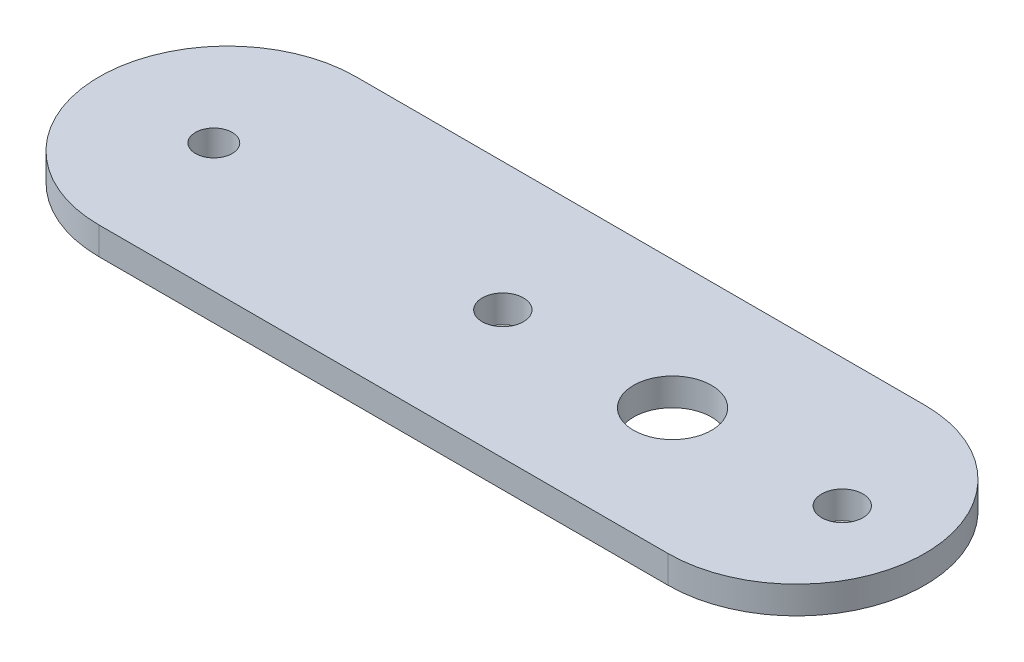
ISO-10303-21;
HEADER;
FILE_DESCRIPTION(('STEP AP214'),'2;1');
FILE_NAME('part.step','',(''),(''),'','','');
FILE_SCHEMA(('AUTOMOTIVE_DESIGN { 1 0 10303 214 1 1 1 1 }'));
ENDSEC;
DATA;
#1=APPLICATION_CONTEXT('core data for automotive mechanical design processes');
#2=APPLICATION_PROTOCOL_DEFINITION('international standard','automotive_design',2000,#1);
#3=PRODUCT_CONTEXT('',#1,'mechanical');
#4=PRODUCT('Part','Part','',(#3));
#5=PRODUCT_RELATED_PRODUCT_CATEGORY('part','',(#4));
#6=PRODUCT_DEFINITION_FORMATION('','',#4);
#7=PRODUCT_DEFINITION_CONTEXT('part definition',#1,'design');
#8=PRODUCT_DEFINITION('design','',#6,#7);
#9=PRODUCT_DEFINITION_SHAPE('','',#8);
#10=(LENGTH_UNIT() NAMED_UNIT(*) SI_UNIT(.MILLI.,.METRE.));
#11=(NAMED_UNIT(*) PLANE_ANGLE_UNIT() SI_UNIT($,.RADIAN.));
#12=(NAMED_UNIT(*) SI_UNIT($,.STERADIAN.) SOLID_ANGLE_UNIT());
#13=UNCERTAINTY_MEASURE_WITH_UNIT(LENGTH_MEASURE(1.E-05),#10,'distance_accuracy_value','');
#14=(GEOMETRIC_REPRESENTATION_CONTEXT(3) GLOBAL_UNCERTAINTY_ASSIGNED_CONTEXT((#13)) GLOBAL_UNIT_ASSIGNED_CONTEXT((#10,
#11,#12)) REPRESENTATION_CONTEXT('',''));
#15=CARTESIAN_POINT('',(0.,0.,0.));
#16=DIRECTION('',(0.,0.,1.));
#17=DIRECTION('',(1.,0.,0.));
#18=AXIS2_PLACEMENT_3D('',#15,#16,#17);
#19=CARTESIAN_POINT('',(-31.,0.,0.));
#20=DIRECTION('',(0.,-1.,0.));
#21=DIRECTION('',(0.,0.,-1.));
#22=AXIS2_PLACEMENT_3D('',#19,#20,#21);
#23=CYLINDRICAL_SURFACE('',#22,14.);
#24=DIRECTION('',(0.,-1.,0.));
#25=VECTOR('',#24,1.);
#26=CARTESIAN_POINT('',(-31.,3.,-14.));
#27=LINE('',#26,#25);
#28=CARTESIAN_POINT('',(-31.,0.,-14.));
#29=VERTEX_POINT('',#28);
#30=CARTESIAN_POINT('',(-31.,3.,-14.));
#31=VERTEX_POINT('',#30);
#32=EDGE_CURVE('E82',#29,#31,#27,.F.);
#33=ORIENTED_EDGE('',*,*,#32,.F.);
#34=CARTESIAN_POINT('',(-31.,0.,0.));
#35=DIRECTION('',(0.,1.,0.));
#36=DIRECTION('',(0.,0.,1.));
#37=AXIS2_PLACEMENT_3D('',#34,#35,#36);
#38=CIRCLE('',#37,14.);
#39=CARTESIAN_POINT('',(-31.,0.,14.));
#40=VERTEX_POINT('',#39);
#41=EDGE_CURVE('E40',#40,#29,#38,.F.);
#42=ORIENTED_EDGE('',*,*,#41,.F.);
#43=DIRECTION('',(0.,-1.,0.));
#44=VECTOR('',#43,1.);
#45=CARTESIAN_POINT('',(-31.,3.,14.));
#46=LINE('',#45,#44);
#47=CARTESIAN_POINT('',(-31.,3.,14.));
#48=VERTEX_POINT('',#47);
#49=EDGE_CURVE('E108',#48,#40,#46,.T.);
#50=ORIENTED_EDGE('',*,*,#49,.F.);
#51=CARTESIAN_POINT('',(-31.,3.,0.));
#52=DIRECTION('',(0.,1.,0.));
#53=DIRECTION('',(0.,0.,1.));
#54=AXIS2_PLACEMENT_3D('',#51,#52,#53);
#55=CIRCLE('',#54,14.);
#56=EDGE_CURVE('E11',#31,#48,#55,.T.);
#57=ORIENTED_EDGE('',*,*,#56,.F.);
#58=EDGE_LOOP('',(#33,#42,#50,#57));
#59=FACE_BOUND('',#58,.T.);
#60=ADVANCED_FACE('F33',(#59),#23,.T.);
#61=CARTESIAN_POINT('',(31.,3.,0.));
#62=DIRECTION('',(0.,-1.,0.));
#63=DIRECTION('',(0.,0.,-1.));
#64=AXIS2_PLACEMENT_3D('',#61,#62,#63);
#65=CYLINDRICAL_SURFACE('',#64,14.);
#66=DIRECTION('',(0.,-1.,0.));
#67=VECTOR('',#66,1.);
#68=CARTESIAN_POINT('',(31.,3.,-14.));
#69=LINE('',#68,#67);
#70=CARTESIAN_POINT('',(30.9999999999999,3.,-14.));
#71=VERTEX_POINT('',#70);
#72=CARTESIAN_POINT('',(30.9999999999999,0.,-14.));
#73=VERTEX_POINT('',#72);
#74=EDGE_CURVE('E75',#71,#73,#69,.T.);
#75=ORIENTED_EDGE('',*,*,#74,.F.);
#76=CARTESIAN_POINT('',(31.,3.,0.));
#77=DIRECTION('',(0.,1.,0.));
#78=DIRECTION('',(0.,0.,1.));
#79=AXIS2_PLACEMENT_3D('',#76,#77,#78);
#80=CIRCLE('',#79,14.);
#81=CARTESIAN_POINT('',(30.9999999999999,3.,14.));
#82=VERTEX_POINT('',#81);
#83=EDGE_CURVE('E83',#82,#71,#80,.T.);
#84=ORIENTED_EDGE('',*,*,#83,.F.);
#85=DIRECTION('',(0.,-1.,0.));
#86=VECTOR('',#85,1.);
#87=CARTESIAN_POINT('',(31.,3.,14.));
#88=LINE('',#87,#86);
#89=CARTESIAN_POINT('',(30.9999999999999,0.,14.));
#90=VERTEX_POINT('',#89);
#91=EDGE_CURVE('E78',#90,#82,#88,.F.);
#92=ORIENTED_EDGE('',*,*,#91,.F.);
#93=CARTESIAN_POINT('',(31.,0.,0.));
#94=DIRECTION('',(0.,1.,0.));
#95=DIRECTION('',(0.,0.,1.));
#96=AXIS2_PLACEMENT_3D('',#93,#94,#95);
#97=CIRCLE('',#96,14.);
#98=EDGE_CURVE('E71',#73,#90,#97,.F.);
#99=ORIENTED_EDGE('',*,*,#98,.F.);
#100=EDGE_LOOP('',(#75,#84,#92,#99));
#101=FACE_BOUND('',#100,.T.);
#102=ADVANCED_FACE('F73',(#101),#65,.T.);
#103=CARTESIAN_POINT('',(0.,3.,0.));
#104=DIRECTION('',(0.,1.,0.));
#105=DIRECTION('',(0.,0.,1.));
#106=AXIS2_PLACEMENT_3D('',#103,#104,#105);
#107=PLANE('',#106);
#108=CARTESIAN_POINT('',(-1.00000000000002,3.,0.));
#109=DIRECTION('',(0.,1.,0.));
#110=DIRECTION('',(0.,0.,1.));
#111=AXIS2_PLACEMENT_3D('',#108,#109,#110);
#112=CIRCLE('',#111,2.25);
#113=CARTESIAN_POINT('',(-1.00000000000002,3.,2.25));
#114=VERTEX_POINT('',#113);
#115=EDGE_CURVE('E132',#114,#114,#112,.T.);
#116=ORIENTED_EDGE('',*,*,#115,.F.);
#117=EDGE_LOOP('',(#116));
#118=FACE_BOUND('',#117,.T.);
#119=CARTESIAN_POINT('',(36.,3.,0.));
#120=DIRECTION('',(0.,1.,0.));
#121=DIRECTION('',(0.,0.,1.));
#122=AXIS2_PLACEMENT_3D('',#119,#120,#121);
#123=CIRCLE('',#122,2.25);
#124=CARTESIAN_POINT('',(36.,3.,2.25));
#125=VERTEX_POINT('',#124);
#126=EDGE_CURVE('E126',#125,#125,#123,.T.);
#127=ORIENTED_EDGE('',*,*,#126,.F.);
#128=EDGE_LOOP('',(#127));
#129=FACE_BOUND('',#128,.T.);
#130=CARTESIAN_POINT('',(17.5,3.,0.));
#131=DIRECTION('',(0.,1.,0.));
#132=DIRECTION('',(0.,0.,1.));
#133=AXIS2_PLACEMENT_3D('',#130,#131,#132);
#134=CIRCLE('',#133,4.25000000000001);
#135=CARTESIAN_POINT('',(17.5,3.,4.25000000000001));
#136=VERTEX_POINT('',#135);
#137=EDGE_CURVE('E96',#136,#136,#134,.T.);
#138=ORIENTED_EDGE('',*,*,#137,.F.);
#139=EDGE_LOOP('',(#138));
#140=FACE_BOUND('',#139,.T.);
#141=DIRECTION('',(-1.,0.,0.));
#142=VECTOR('',#141,1.);
#143=CARTESIAN_POINT('',(-45.,3.,-14.));
#144=LINE('',#143,#142);
#145=EDGE_CURVE('E90',#71,#31,#144,.T.);
#146=ORIENTED_EDGE('',*,*,#145,.T.);
#147=ORIENTED_EDGE('',*,*,#56,.T.);
#148=DIRECTION('',(1.,0.,0.));
#149=VECTOR('',#148,1.);
#150=CARTESIAN_POINT('',(-45.,3.,14.));
#151=LINE('',#150,#149);
#152=EDGE_CURVE('E91',#48,#82,#151,.T.);
#153=ORIENTED_EDGE('',*,*,#152,.T.);
#154=ORIENTED_EDGE('',*,*,#83,.T.);
#155=EDGE_LOOP('',(#146,#147,#153,#154));
#156=FACE_BOUND('',#155,.T.);
#157=CARTESIAN_POINT('',(-32.5,3.,0.));
#158=DIRECTION('',(0.,1.,0.));
#159=DIRECTION('',(0.,0.,1.));
#160=AXIS2_PLACEMENT_3D('',#157,#158,#159);
#161=CIRCLE('',#160,2.);
#162=CARTESIAN_POINT('',(-32.5,3.,2.));
#163=VERTEX_POINT('',#162);
#164=EDGE_CURVE('E116',#163,#163,#161,.T.);
#165=ORIENTED_EDGE('',*,*,#164,.F.);
#166=EDGE_LOOP('',(#165));
#167=FACE_BOUND('',#166,.T.);
#168=ADVANCED_FACE('F112',(#118,#129,#140,#156,#167),#107,.T.);
#169=CARTESIAN_POINT('',(0.,0.,0.));
#170=DIRECTION('',(0.,1.,0.));
#171=DIRECTION('',(0.,0.,1.));
#172=AXIS2_PLACEMENT_3D('',#169,#170,#171);
#173=PLANE('',#172);
#174=CARTESIAN_POINT('',(-1.00000000000002,0.,0.));
#175=DIRECTION('',(0.,1.,0.));
#176=DIRECTION('',(0.,0.,1.));
#177=AXIS2_PLACEMENT_3D('',#174,#175,#176);
#178=CIRCLE('',#177,2.25);
#179=CARTESIAN_POINT('',(-1.00000000000002,0.,2.25));
#180=VERTEX_POINT('',#179);
#181=EDGE_CURVE('E129',#180,#180,#178,.F.);
#182=ORIENTED_EDGE('',*,*,#181,.F.);
#183=EDGE_LOOP('',(#182));
#184=FACE_BOUND('',#183,.T.);
#185=CARTESIAN_POINT('',(36.,0.,0.));
#186=DIRECTION('',(0.,1.,0.));
#187=DIRECTION('',(0.,0.,1.));
#188=AXIS2_PLACEMENT_3D('',#185,#186,#187);
#189=CIRCLE('',#188,2.25);
#190=CARTESIAN_POINT('',(36.,0.,2.25));
#191=VERTEX_POINT('',#190);
#192=EDGE_CURVE('E121',#191,#191,#189,.F.);
#193=ORIENTED_EDGE('',*,*,#192,.F.);
#194=EDGE_LOOP('',(#193));
#195=FACE_BOUND('',#194,.T.);
#196=CARTESIAN_POINT('',(17.5,0.,0.));
#197=DIRECTION('',(0.,1.,0.));
#198=DIRECTION('',(0.,0.,1.));
#199=AXIS2_PLACEMENT_3D('',#196,#197,#198);
#200=CIRCLE('',#199,4.25000000000001);
#201=CARTESIAN_POINT('',(17.5,0.,4.25000000000001));
#202=VERTEX_POINT('',#201);
#203=EDGE_CURVE('E100',#202,#202,#200,.T.);
#204=ORIENTED_EDGE('',*,*,#203,.T.);
#205=EDGE_LOOP('',(#204));
#206=FACE_BOUND('',#205,.T.);
#207=DIRECTION('',(1.,0.,0.));
#208=VECTOR('',#207,1.);
#209=CARTESIAN_POINT('',(-45.,0.,14.));
#210=LINE('',#209,#208);
#211=EDGE_CURVE('E95',#40,#90,#210,.T.);
#212=ORIENTED_EDGE('',*,*,#211,.F.);
#213=ORIENTED_EDGE('',*,*,#41,.T.);
#214=DIRECTION('',(-1.,0.,0.));
#215=VECTOR('',#214,1.);
#216=CARTESIAN_POINT('',(-45.,0.,-14.));
#217=LINE('',#216,#215);
#218=EDGE_CURVE('E89',#73,#29,#217,.T.);
#219=ORIENTED_EDGE('',*,*,#218,.F.);
#220=ORIENTED_EDGE('',*,*,#98,.T.);
#221=EDGE_LOOP('',(#212,#213,#219,#220));
#222=FACE_BOUND('',#221,.T.);
#223=CARTESIAN_POINT('',(-32.5,0.,0.));
#224=DIRECTION('',(0.,1.,0.));
#225=DIRECTION('',(0.,0.,1.));
#226=AXIS2_PLACEMENT_3D('',#223,#224,#225);
#227=CIRCLE('',#226,2.);
#228=CARTESIAN_POINT('',(-32.5,0.,2.));
#229=VERTEX_POINT('',#228);
#230=EDGE_CURVE('E118',#229,#229,#227,.T.);
#231=ORIENTED_EDGE('',*,*,#230,.T.);
#232=EDGE_LOOP('',(#231));
#233=FACE_BOUND('',#232,.T.);
#234=ADVANCED_FACE('F93',(#184,#195,#206,#222,#233),#173,.F.);
#235=CARTESIAN_POINT('',(-45.,3.,-14.));
#236=DIRECTION('',(0.,0.,1.));
#237=DIRECTION('',(1.,0.,0.));
#238=AXIS2_PLACEMENT_3D('',#235,#236,#237);
#239=PLANE('',#238);
#240=ORIENTED_EDGE('',*,*,#218,.T.);
#241=ORIENTED_EDGE('',*,*,#32,.T.);
#242=ORIENTED_EDGE('',*,*,#145,.F.);
#243=ORIENTED_EDGE('',*,*,#74,.T.);
#244=EDGE_LOOP('',(#240,#241,#242,#243));
#245=FACE_BOUND('',#244,.T.);
#246=ADVANCED_FACE('F87',(#245),#239,.F.);
#247=CARTESIAN_POINT('',(-45.,3.,14.));
#248=DIRECTION('',(0.,0.,-1.));
#249=DIRECTION('',(-1.,0.,0.));
#250=AXIS2_PLACEMENT_3D('',#247,#248,#249);
#251=PLANE('',#250);
#252=ORIENTED_EDGE('',*,*,#152,.F.);
#253=ORIENTED_EDGE('',*,*,#49,.T.);
#254=ORIENTED_EDGE('',*,*,#211,.T.);
#255=ORIENTED_EDGE('',*,*,#91,.T.);
#256=EDGE_LOOP('',(#252,#253,#254,#255));
#257=FACE_BOUND('',#256,.T.);
#258=ADVANCED_FACE('F111',(#257),#251,.F.);
#259=CARTESIAN_POINT('',(17.5,3.,0.));
#260=DIRECTION('',(0.,-1.,0.));
#261=DIRECTION('',(0.,0.,-1.));
#262=AXIS2_PLACEMENT_3D('',#259,#260,#261);
#263=CYLINDRICAL_SURFACE('',#262,4.25000000000001);
#264=ORIENTED_EDGE('',*,*,#137,.T.);
#265=EDGE_LOOP('',(#264));
#266=FACE_BOUND('',#265,.T.);
#267=ORIENTED_EDGE('',*,*,#203,.F.);
#268=EDGE_LOOP('',(#267));
#269=FACE_BOUND('',#268,.T.);
#270=ADVANCED_FACE('F146',(#266,#269),#263,.F.);
#271=CARTESIAN_POINT('',(-32.5,3.,0.));
#272=DIRECTION('',(0.,-1.,0.));
#273=DIRECTION('',(0.,0.,-1.));
#274=AXIS2_PLACEMENT_3D('',#271,#272,#273);
#275=CYLINDRICAL_SURFACE('',#274,2.);
#276=ORIENTED_EDGE('',*,*,#164,.T.);
#277=EDGE_LOOP('',(#276));
#278=FACE_BOUND('',#277,.T.);
#279=ORIENTED_EDGE('',*,*,#230,.F.);
#280=EDGE_LOOP('',(#279));
#281=FACE_BOUND('',#280,.T.);
#282=ADVANCED_FACE('F149',(#278,#281),#275,.F.);
#283=CARTESIAN_POINT('',(36.,-0.00100000000000013,0.));
#284=DIRECTION('',(0.,1.,0.));
#285=DIRECTION('',(0.,0.,1.));
#286=AXIS2_PLACEMENT_3D('',#283,#284,#285);
#287=CYLINDRICAL_SURFACE('',#286,2.25);
#288=CARTESIAN_POINT('',(36.,3.,2.25));
#289=CARTESIAN_POINT('',(36.,2.96875,2.25));
#290=CARTESIAN_POINT('',(36.,2.9375,2.25));
#291=CARTESIAN_POINT('',(36.,2.875,2.25));
#292=CARTESIAN_POINT('',(36.,2.84375,2.25));
#293=CARTESIAN_POINT('',(36.,2.78125,2.25));
#294=CARTESIAN_POINT('',(36.,2.75,2.25));
#295=CARTESIAN_POINT('',(36.,2.6875,2.25));
#296=CARTESIAN_POINT('',(36.,2.65625,2.25));
#297=CARTESIAN_POINT('',(36.,2.59375,2.25));
#298=CARTESIAN_POINT('',(36.,2.5625,2.25));
#299=CARTESIAN_POINT('',(36.,2.5,2.25));
#300=CARTESIAN_POINT('',(36.,2.46875,2.25));
#301=CARTESIAN_POINT('',(36.,2.40625,2.25));
#302=CARTESIAN_POINT('',(36.,2.375,2.25));
#303=CARTESIAN_POINT('',(36.,2.3125,2.25));
#304=CARTESIAN_POINT('',(36.,2.28125,2.25));
#305=CARTESIAN_POINT('',(36.,2.21875,2.25));
#306=CARTESIAN_POINT('',(36.,2.1875,2.25));
#307=CARTESIAN_POINT('',(36.,2.125,2.25));
#308=CARTESIAN_POINT('',(36.,2.09375,2.25));
#309=CARTESIAN_POINT('',(36.,2.03125,2.25));
#310=CARTESIAN_POINT('',(36.,2.,2.25));
#311=CARTESIAN_POINT('',(36.,1.9375,2.25));
#312=CARTESIAN_POINT('',(36.,1.90625,2.25));
#313=CARTESIAN_POINT('',(36.,1.84375,2.25));
#314=CARTESIAN_POINT('',(36.,1.8125,2.25));
#315=CARTESIAN_POINT('',(36.,1.75,2.25));
#316=CARTESIAN_POINT('',(36.,1.71875,2.25));
#317=CARTESIAN_POINT('',(36.,1.65625,2.25));
#318=CARTESIAN_POINT('',(36.,1.625,2.25));
#319=CARTESIAN_POINT('',(36.,1.5625,2.25));
#320=CARTESIAN_POINT('',(36.,1.53125,2.25));
#321=CARTESIAN_POINT('',(36.,1.46875,2.25));
#322=CARTESIAN_POINT('',(36.,1.4375,2.25));
#323=CARTESIAN_POINT('',(36.,1.375,2.25));
#324=CARTESIAN_POINT('',(36.,1.34375,2.25));
#325=CARTESIAN_POINT('',(36.,1.28125,2.25));
#326=CARTESIAN_POINT('',(36.,1.25,2.25));
#327=CARTESIAN_POINT('',(36.,1.1875,2.25));
#328=CARTESIAN_POINT('',(36.,1.15625,2.25));
#329=CARTESIAN_POINT('',(36.,1.09375,2.25));
#330=CARTESIAN_POINT('',(36.,1.0625,2.25));
#331=CARTESIAN_POINT('',(36.,1.,2.25));
#332=CARTESIAN_POINT('',(36.,0.96875,2.25));
#333=CARTESIAN_POINT('',(36.,0.90625,2.25));
#334=CARTESIAN_POINT('',(36.,0.875,2.25));
#335=CARTESIAN_POINT('',(36.,0.8125,2.25));
#336=CARTESIAN_POINT('',(36.,0.78125,2.25));
#337=CARTESIAN_POINT('',(36.,0.71875,2.25));
#338=CARTESIAN_POINT('',(36.,0.6875,2.25));
#339=CARTESIAN_POINT('',(36.,0.625,2.25));
#340=CARTESIAN_POINT('',(36.,0.59375,2.25));
#341=CARTESIAN_POINT('',(36.,0.53125,2.25));
#342=CARTESIAN_POINT('',(36.,0.5,2.25));
#343=CARTESIAN_POINT('',(36.,0.4375,2.25));
#344=CARTESIAN_POINT('',(36.,0.40625,2.25));
#345=CARTESIAN_POINT('',(36.,0.34375,2.25));
#346=CARTESIAN_POINT('',(36.,0.3125,2.25));
#347=CARTESIAN_POINT('',(36.,0.25,2.25));
#348=CARTESIAN_POINT('',(36.,0.21875,2.25));
#349=CARTESIAN_POINT('',(36.,0.15625,2.25));
#350=CARTESIAN_POINT('',(36.,0.125,2.25));
#351=CARTESIAN_POINT('',(36.,0.0625000000000001,2.25));
#352=CARTESIAN_POINT('',(36.,0.0312500000000001,2.25));
#353=CARTESIAN_POINT('',(36.,0.,2.25));
#354=B_SPLINE_CURVE_WITH_KNOTS('',3,(#288,#289,#290,#291,#292,#293,#294,#295,#296,#297,#298,
#299,#300,#301,#302,#303,#304,#305,#306,#307,#308,#309,#310,#311,#312,#313,#314,#315,#316,#317,
#318,#319,#320,#321,#322,#323,#324,#325,#326,#327,#328,#329,#330,#331,#332,#333,#334,#335,#336,
#337,#338,#339,#340,#341,#342,#343,#344,#345,#346,#347,#348,#349,#350,#351,#352,#353),
.UNSPECIFIED.,.F.,.F.,(4,2,2,2,2,2,2,2,2,2,2,2,2,2,2,2,2,2,2,2,2,2,2,2,2,2,2,2,2,2,2,2,4),(0.,
0.0937500000000001,0.1875,0.28125,0.375,0.46875,0.5625,0.65625,0.75,0.84375,0.9375,1.03125,
1.125,1.21875,1.3125,1.40625,1.5,1.59375,1.6875,1.78125,1.875,1.96875,2.0625,2.15625,2.25,
2.34375,2.4375,2.53125,2.625,2.71875,2.8125,2.90625,3.),.UNSPECIFIED.);
#355=EDGE_CURVE('BSEAM184',#125,#191,#354,.T.);
#356=ORIENTED_EDGE('',*,*,#126,.T.);
#357=ORIENTED_EDGE('',*,*,#192,.T.);
#358=ORIENTED_EDGE('',*,*,#355,.T.);
#359=ORIENTED_EDGE('',*,*,#355,.F.);
#360=EDGE_LOOP('',(#356,#358,#357,#359));
#361=FACE_BOUND('',#360,.T.);
#362=ADVANCED_FACE('F184',(#361),#287,.F.);
#363=CARTESIAN_POINT('',(-1.00000000000002,-0.00100000000000013,0.));
#364=DIRECTION('',(0.,1.,0.));
#365=DIRECTION('',(0.,0.,1.));
#366=AXIS2_PLACEMENT_3D('',#363,#364,#365);
#367=CYLINDRICAL_SURFACE('',#366,2.25);
#368=CARTESIAN_POINT('',(-1.00000000000002,3.,2.25));
#369=CARTESIAN_POINT('',(-1.00000000000002,2.96875,2.25));
#370=CARTESIAN_POINT('',(-1.00000000000002,2.9375,2.25));
#371=CARTESIAN_POINT('',(-1.00000000000002,2.875,2.25));
#372=CARTESIAN_POINT('',(-1.00000000000002,2.84375,2.25));
#373=CARTESIAN_POINT('',(-1.00000000000002,2.78125,2.25));
#374=CARTESIAN_POINT('',(-1.00000000000002,2.75,2.25));
#375=CARTESIAN_POINT('',(-1.00000000000002,2.6875,2.25));
#376=CARTESIAN_POINT('',(-1.00000000000002,2.65625,2.25));
#377=CARTESIAN_POINT('',(-1.00000000000002,2.59375,2.25));
#378=CARTESIAN_POINT('',(-1.00000000000002,2.5625,2.25));
#379=CARTESIAN_POINT('',(-1.00000000000002,2.5,2.25));
#380=CARTESIAN_POINT('',(-1.00000000000002,2.46875,2.25));
#381=CARTESIAN_POINT('',(-1.00000000000002,2.40625,2.25));
#382=CARTESIAN_POINT('',(-1.00000000000002,2.375,2.25));
#383=CARTESIAN_POINT('',(-1.00000000000002,2.3125,2.25));
#384=CARTESIAN_POINT('',(-1.00000000000002,2.28125,2.25));
#385=CARTESIAN_POINT('',(-1.00000000000002,2.21875,2.25));
#386=CARTESIAN_POINT('',(-1.00000000000002,2.1875,2.25));
#387=CARTESIAN_POINT('',(-1.00000000000002,2.125,2.25));
#388=CARTESIAN_POINT('',(-1.00000000000002,2.09375,2.25));
#389=CARTESIAN_POINT('',(-1.00000000000002,2.03125,2.25));
#390=CARTESIAN_POINT('',(-1.00000000000002,2.,2.25));
#391=CARTESIAN_POINT('',(-1.00000000000002,1.9375,2.25));
#392=CARTESIAN_POINT('',(-1.00000000000002,1.90625,2.25));
#393=CARTESIAN_POINT('',(-1.00000000000002,1.84375,2.25));
#394=CARTESIAN_POINT('',(-1.00000000000002,1.8125,2.25));
#395=CARTESIAN_POINT('',(-1.00000000000002,1.75,2.25));
#396=CARTESIAN_POINT('',(-1.00000000000002,1.71875,2.25));
#397=CARTESIAN_POINT('',(-1.00000000000002,1.65625,2.25));
#398=CARTESIAN_POINT('',(-1.00000000000002,1.625,2.25));
#399=CARTESIAN_POINT('',(-1.00000000000002,1.5625,2.25));
#400=CARTESIAN_POINT('',(-1.00000000000002,1.53125,2.25));
#401=CARTESIAN_POINT('',(-1.00000000000002,1.46875,2.25));
#402=CARTESIAN_POINT('',(-1.00000000000002,1.4375,2.25));
#403=CARTESIAN_POINT('',(-1.00000000000002,1.375,2.25));
#404=CARTESIAN_POINT('',(-1.00000000000002,1.34375,2.25));
#405=CARTESIAN_POINT('',(-1.00000000000002,1.28125,2.25));
#406=CARTESIAN_POINT('',(-1.00000000000002,1.25,2.25));
#407=CARTESIAN_POINT('',(-1.00000000000002,1.1875,2.25));
#408=CARTESIAN_POINT('',(-1.00000000000002,1.15625,2.25));
#409=CARTESIAN_POINT('',(-1.00000000000002,1.09375,2.25));
#410=CARTESIAN_POINT('',(-1.00000000000002,1.0625,2.25));
#411=CARTESIAN_POINT('',(-1.00000000000002,1.,2.25));
#412=CARTESIAN_POINT('',(-1.00000000000002,0.96875,2.25));
#413=CARTESIAN_POINT('',(-1.00000000000002,0.90625,2.25));
#414=CARTESIAN_POINT('',(-1.00000000000002,0.875,2.25));
#415=CARTESIAN_POINT('',(-1.00000000000002,0.8125,2.25));
#416=CARTESIAN_POINT('',(-1.00000000000002,0.78125,2.25));
#417=CARTESIAN_POINT('',(-1.00000000000002,0.71875,2.25));
#418=CARTESIAN_POINT('',(-1.00000000000002,0.6875,2.25));
#419=CARTESIAN_POINT('',(-1.00000000000002,0.625,2.25));
#420=CARTESIAN_POINT('',(-1.00000000000002,0.59375,2.25));
#421=CARTESIAN_POINT('',(-1.00000000000002,0.53125,2.25));
#422=CARTESIAN_POINT('',(-1.00000000000002,0.5,2.25));
#423=CARTESIAN_POINT('',(-1.00000000000002,0.4375,2.25));
#424=CARTESIAN_POINT('',(-1.00000000000002,0.40625,2.25));
#425=CARTESIAN_POINT('',(-1.00000000000002,0.34375,2.25));
#426=CARTESIAN_POINT('',(-1.00000000000002,0.3125,2.25));
#427=CARTESIAN_POINT('',(-1.00000000000002,0.25,2.25));
#428=CARTESIAN_POINT('',(-1.00000000000002,0.21875,2.25));
#429=CARTESIAN_POINT('',(-1.00000000000002,0.15625,2.25));
#430=CARTESIAN_POINT('',(-1.00000000000002,0.125,2.25));
#431=CARTESIAN_POINT('',(-1.00000000000002,0.0625000000000001,2.25));
#432=CARTESIAN_POINT('',(-1.00000000000002,0.0312500000000001,2.25));
#433=CARTESIAN_POINT('',(-1.00000000000002,0.,2.25));
#434=B_SPLINE_CURVE_WITH_KNOTS('',3,(#368,#369,#370,#371,#372,#373,#374,#375,#376,#377,#378,
#379,#380,#381,#382,#383,#384,#385,#386,#387,#388,#389,#390,#391,#392,#393,#394,#395,#396,#397,
#398,#399,#400,#401,#402,#403,#404,#405,#406,#407,#408,#409,#410,#411,#412,#413,#414,#415,#416,
#417,#418,#419,#420,#421,#422,#423,#424,#425,#426,#427,#428,#429,#430,#431,#432,#433),
.UNSPECIFIED.,.F.,.F.,(4,2,2,2,2,2,2,2,2,2,2,2,2,2,2,2,2,2,2,2,2,2,2,2,2,2,2,2,2,2,2,2,4),(0.,
0.0937500000000001,0.1875,0.28125,0.375,0.46875,0.5625,0.65625,0.75,0.84375,0.9375,1.03125,
1.125,1.21875,1.3125,1.40625,1.5,1.59375,1.6875,1.78125,1.875,1.96875,2.0625,2.15625,2.25,
2.34375,2.4375,2.53125,2.625,2.71875,2.8125,2.90625,3.),.UNSPECIFIED.);
#435=EDGE_CURVE('BSEAM136',#114,#180,#434,.T.);
#436=ORIENTED_EDGE('',*,*,#115,.T.);
#437=ORIENTED_EDGE('',*,*,#181,.T.);
#438=ORIENTED_EDGE('',*,*,#435,.T.);
#439=ORIENTED_EDGE('',*,*,#435,.F.);
#440=EDGE_LOOP('',(#436,#438,#437,#439));
#441=FACE_BOUND('',#440,.T.);
#442=ADVANCED_FACE('F136',(#441),#367,.F.);
#443=CLOSED_SHELL('',(#60,#102,#168,#234,#246,#258,#270,#282,#362,#442));
#444=MANIFOLD_SOLID_BREP('B2',#443);
#445=ADVANCED_BREP_SHAPE_REPRESENTATION('',(#18,#444),#14);
#446=SHAPE_DEFINITION_REPRESENTATION(#9,#445);
ENDSEC;
END-ISO-10303-21;
